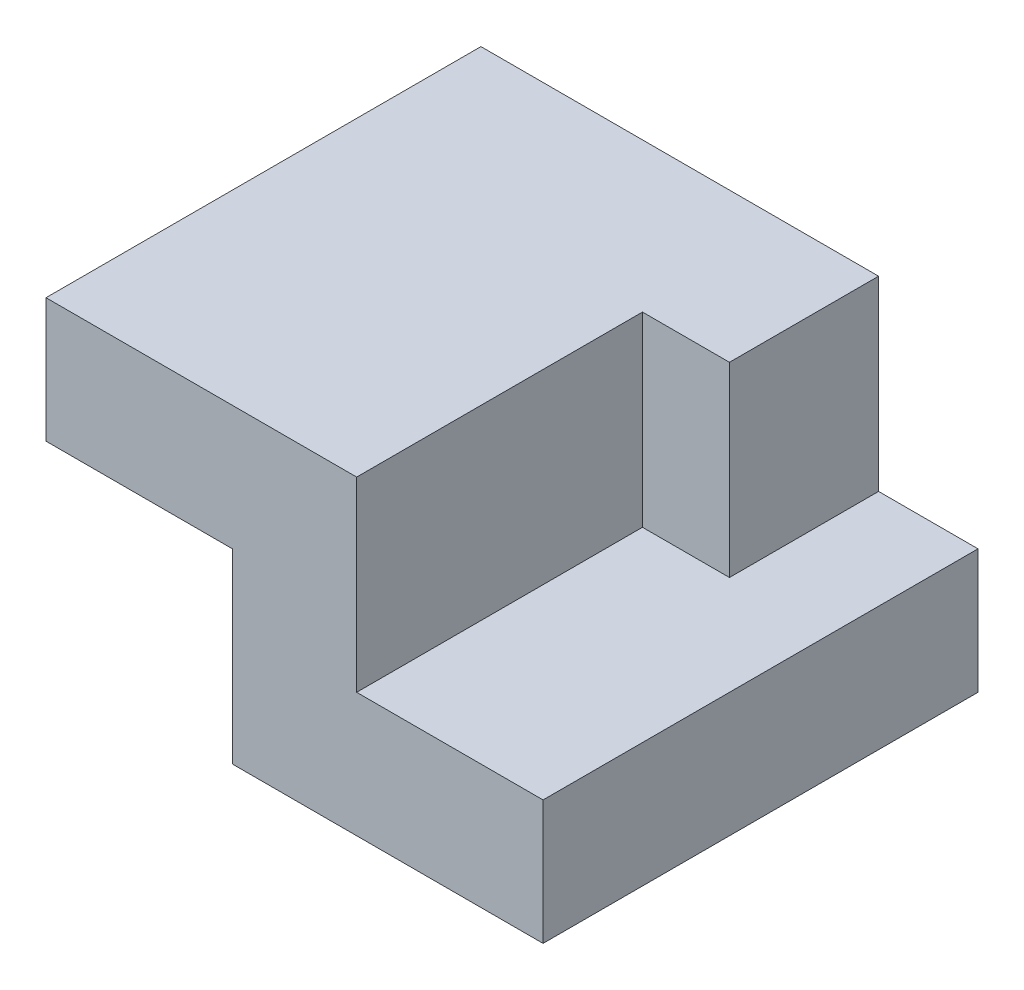
ISO-10303-21;
HEADER;
FILE_DESCRIPTION(('STEP AP214'),'2;1');
FILE_NAME('part.step','',(''),(''),'','','');
FILE_SCHEMA(('AUTOMOTIVE_DESIGN { 1 0 10303 214 1 1 1 1 }'));
ENDSEC;
DATA;
#1=APPLICATION_CONTEXT('core data for automotive mechanical design processes');
#2=APPLICATION_PROTOCOL_DEFINITION('international standard','automotive_design',2000,#1);
#3=PRODUCT_CONTEXT('',#1,'mechanical');
#4=PRODUCT('Part','Part','',(#3));
#5=PRODUCT_RELATED_PRODUCT_CATEGORY('part','',(#4));
#6=PRODUCT_DEFINITION_FORMATION('','',#4);
#7=PRODUCT_DEFINITION_CONTEXT('part definition',#1,'design');
#8=PRODUCT_DEFINITION('design','',#6,#7);
#9=PRODUCT_DEFINITION_SHAPE('','',#8);
#10=(LENGTH_UNIT() NAMED_UNIT(*) SI_UNIT(.MILLI.,.METRE.));
#11=(NAMED_UNIT(*) PLANE_ANGLE_UNIT() SI_UNIT($,.RADIAN.));
#12=(NAMED_UNIT(*) SI_UNIT($,.STERADIAN.) SOLID_ANGLE_UNIT());
#13=UNCERTAINTY_MEASURE_WITH_UNIT(LENGTH_MEASURE(1.E-05),#10,'distance_accuracy_value','');
#14=(GEOMETRIC_REPRESENTATION_CONTEXT(3) GLOBAL_UNCERTAINTY_ASSIGNED_CONTEXT((#13)) GLOBAL_UNIT_ASSIGNED_CONTEXT((#10,
#11,#12)) REPRESENTATION_CONTEXT('',''));
#15=CARTESIAN_POINT('',(0.,0.,0.));
#16=DIRECTION('',(0.,0.,1.));
#17=DIRECTION('',(1.,0.,0.));
#18=AXIS2_PLACEMENT_3D('',#15,#16,#17);
#19=CARTESIAN_POINT('',(-8.92031029265963,45.8552321324574,70.));
#20=DIRECTION('',(-1.,0.,0.));
#21=DIRECTION('',(0.,0.,1.));
#22=AXIS2_PLACEMENT_3D('',#19,#20,#21);
#23=PLANE('',#22);
#24=DIRECTION('',(0.,-1.,0.));
#25=VECTOR('',#24,1.);
#26=CARTESIAN_POINT('',(-8.92031029265963,75.8552321324574,24.));
#27=LINE('',#26,#25);
#28=CARTESIAN_POINT('',(-8.92031029265963,75.8552321324574,24.));
#29=VERTEX_POINT('',#28);
#30=CARTESIAN_POINT('',(-8.92031029265963,45.8552321324574,24.));
#31=VERTEX_POINT('',#30);
#32=EDGE_CURVE('E47',#29,#31,#27,.T.);
#33=ORIENTED_EDGE('',*,*,#32,.F.);
#34=DIRECTION('',(0.,0.,-1.));
#35=VECTOR('',#34,1.);
#36=CARTESIAN_POINT('',(-8.92031029265963,75.8552321324574,70.));
#37=LINE('',#36,#35);
#38=CARTESIAN_POINT('',(-8.92031029265963,75.8552321324574,70.));
#39=VERTEX_POINT('',#38);
#40=EDGE_CURVE('E11',#39,#29,#37,.T.);
#41=ORIENTED_EDGE('',*,*,#40,.F.);
#42=DIRECTION('',(0.,1.,0.));
#43=VECTOR('',#42,1.);
#44=CARTESIAN_POINT('',(-8.92031029265963,45.8552321324574,70.));
#45=LINE('',#44,#43);
#46=CARTESIAN_POINT('',(-8.92031029265963,45.8552321324574,70.));
#47=VERTEX_POINT('',#46);
#48=EDGE_CURVE('E140',#47,#39,#45,.T.);
#49=ORIENTED_EDGE('',*,*,#48,.F.);
#50=DIRECTION('',(0.,0.,-1.));
#51=VECTOR('',#50,1.);
#52=CARTESIAN_POINT('',(-8.92031029265963,45.8552321324574,70.));
#53=LINE('',#52,#51);
#54=EDGE_CURVE('E157',#47,#31,#53,.T.);
#55=ORIENTED_EDGE('',*,*,#54,.T.);
#56=EDGE_LOOP('',(#33,#41,#49,#55));
#57=FACE_BOUND('',#56,.T.);
#58=ADVANCED_FACE('F33',(#57),#23,.F.);
#59=CARTESIAN_POINT('',(21.0796897073403,45.8552321324574,70.));
#60=DIRECTION('',(0.,-1.,0.));
#61=DIRECTION('',(1.,0.,0.));
#62=AXIS2_PLACEMENT_3D('',#59,#60,#61);
#63=PLANE('',#62);
#64=DIRECTION('',(-1.,0.,0.));
#65=VECTOR('',#64,1.);
#66=CARTESIAN_POINT('',(5.07968970734037,45.8552321324574,24.));
#67=LINE('',#66,#65);
#68=CARTESIAN_POINT('',(5.07968970734037,45.8552321324574,24.));
#69=VERTEX_POINT('',#68);
#70=EDGE_CURVE('E136',#69,#31,#67,.T.);
#71=ORIENTED_EDGE('',*,*,#70,.T.);
#72=ORIENTED_EDGE('',*,*,#54,.F.);
#73=DIRECTION('',(-1.,0.,0.));
#74=VECTOR('',#73,1.);
#75=CARTESIAN_POINT('',(21.0796897073403,45.8552321324574,70.));
#76=LINE('',#75,#74);
#77=CARTESIAN_POINT('',(21.0796897073403,45.8552321324574,70.));
#78=VERTEX_POINT('',#77);
#79=EDGE_CURVE('E156',#78,#47,#76,.T.);
#80=ORIENTED_EDGE('',*,*,#79,.F.);
#81=DIRECTION('',(0.,0.,-1.));
#82=VECTOR('',#81,1.);
#83=CARTESIAN_POINT('',(21.0796897073403,45.8552321324574,70.));
#84=LINE('',#83,#82);
#85=CARTESIAN_POINT('',(21.0796897073403,45.8552321324574,0.));
#86=VERTEX_POINT('',#85);
#87=EDGE_CURVE('E170',#78,#86,#84,.T.);
#88=ORIENTED_EDGE('',*,*,#87,.T.);
#89=DIRECTION('',(-1.,0.,0.));
#90=VECTOR('',#89,1.);
#91=CARTESIAN_POINT('',(21.0796897073403,45.8552321324574,0.));
#92=LINE('',#91,#90);
#93=CARTESIAN_POINT('',(5.07968970734037,45.8552321324574,0.));
#94=VERTEX_POINT('',#93);
#95=EDGE_CURVE('E144',#86,#94,#92,.T.);
#96=ORIENTED_EDGE('',*,*,#95,.T.);
#97=DIRECTION('',(0.,0.,-1.));
#98=VECTOR('',#97,1.);
#99=CARTESIAN_POINT('',(5.07968970734037,45.8552321324574,0.));
#100=LINE('',#99,#98);
#101=EDGE_CURVE('E54',#69,#94,#100,.T.);
#102=ORIENTED_EDGE('',*,*,#101,.F.);
#103=EDGE_LOOP('',(#71,#72,#80,#88,#96,#102));
#104=FACE_BOUND('',#103,.T.);
#105=ADVANCED_FACE('F194',(#104),#63,.F.);
#106=CARTESIAN_POINT('',(-8.92031029265963,75.8552321324574,70.));
#107=DIRECTION('',(0.,-1.,0.));
#108=DIRECTION('',(0.,0.,-1.));
#109=AXIS2_PLACEMENT_3D('',#106,#107,#108);
#110=PLANE('',#109);
#111=DIRECTION('',(-1.,0.,0.));
#112=VECTOR('',#111,1.);
#113=CARTESIAN_POINT('',(-8.92031029265963,75.8552321324574,0.));
#114=LINE('',#113,#112);
#115=CARTESIAN_POINT('',(5.07968970734037,75.8552321324574,0.));
#116=VERTEX_POINT('',#115);
#117=CARTESIAN_POINT('',(-58.9203102926596,75.8552321324574,0.));
#118=VERTEX_POINT('',#117);
#119=EDGE_CURVE('E110',#116,#118,#114,.T.);
#120=ORIENTED_EDGE('',*,*,#119,.T.);
#121=DIRECTION('',(0.,0.,-1.));
#122=VECTOR('',#121,1.);
#123=CARTESIAN_POINT('',(-58.9203102926596,75.8552321324574,70.));
#124=LINE('',#123,#122);
#125=CARTESIAN_POINT('',(-58.9203102926596,75.8552321324574,70.));
#126=VERTEX_POINT('',#125);
#127=EDGE_CURVE('E40',#126,#118,#124,.T.);
#128=ORIENTED_EDGE('',*,*,#127,.F.);
#129=DIRECTION('',(-1.,0.,0.));
#130=VECTOR('',#129,1.);
#131=CARTESIAN_POINT('',(-8.92031029265963,75.8552321324574,70.));
#132=LINE('',#131,#130);
#133=EDGE_CURVE('E143',#39,#126,#132,.T.);
#134=ORIENTED_EDGE('',*,*,#133,.F.);
#135=ORIENTED_EDGE('',*,*,#40,.T.);
#136=DIRECTION('',(-1.,0.,0.));
#137=VECTOR('',#136,1.);
#138=CARTESIAN_POINT('',(5.07968970734037,75.8552321324574,24.));
#139=LINE('',#138,#137);
#140=CARTESIAN_POINT('',(5.07968970734037,75.8552321324574,24.));
#141=VERTEX_POINT('',#140);
#142=EDGE_CURVE('E121',#141,#29,#139,.T.);
#143=ORIENTED_EDGE('',*,*,#142,.F.);
#144=DIRECTION('',(0.,0.,1.));
#145=VECTOR('',#144,1.);
#146=CARTESIAN_POINT('',(5.07968970734037,75.8552321324574,0.));
#147=LINE('',#146,#145);
#148=EDGE_CURVE('E124',#116,#141,#147,.T.);
#149=ORIENTED_EDGE('',*,*,#148,.F.);
#150=EDGE_LOOP('',(#120,#128,#134,#135,#143,#149));
#151=FACE_BOUND('',#150,.T.);
#152=ADVANCED_FACE('F125',(#151),#110,.F.);
#153=CARTESIAN_POINT('',(-58.9203102926596,75.8552321324574,70.));
#154=DIRECTION('',(1.,0.,0.));
#155=DIRECTION('',(0.,0.,-1.));
#156=AXIS2_PLACEMENT_3D('',#153,#154,#155);
#157=PLANE('',#156);
#158=DIRECTION('',(0.,-1.,0.));
#159=VECTOR('',#158,1.);
#160=CARTESIAN_POINT('',(-58.9203102926596,75.8552321324574,0.));
#161=LINE('',#160,#159);
#162=CARTESIAN_POINT('',(-58.9203102926596,55.8552321324574,0.));
#163=VERTEX_POINT('',#162);
#164=EDGE_CURVE('E117',#118,#163,#161,.T.);
#165=ORIENTED_EDGE('',*,*,#164,.T.);
#166=DIRECTION('',(0.,0.,-1.));
#167=VECTOR('',#166,1.);
#168=CARTESIAN_POINT('',(-58.9203102926596,55.8552321324574,70.));
#169=LINE('',#168,#167);
#170=CARTESIAN_POINT('',(-58.9203102926596,55.8552321324574,70.));
#171=VERTEX_POINT('',#170);
#172=EDGE_CURVE('E182',#171,#163,#169,.T.);
#173=ORIENTED_EDGE('',*,*,#172,.F.);
#174=DIRECTION('',(0.,-1.,0.));
#175=VECTOR('',#174,1.);
#176=CARTESIAN_POINT('',(-58.9203102926596,75.8552321324574,70.));
#177=LINE('',#176,#175);
#178=EDGE_CURVE('E146',#126,#171,#177,.T.);
#179=ORIENTED_EDGE('',*,*,#178,.F.);
#180=ORIENTED_EDGE('',*,*,#127,.T.);
#181=EDGE_LOOP('',(#165,#173,#179,#180));
#182=FACE_BOUND('',#181,.T.);
#183=ADVANCED_FACE('F186',(#182),#157,.F.);
#184=CARTESIAN_POINT('',(-58.9203102926596,55.8552321324574,70.));
#185=DIRECTION('',(0.,1.,0.));
#186=DIRECTION('',(0.,0.,1.));
#187=AXIS2_PLACEMENT_3D('',#184,#185,#186);
#188=PLANE('',#187);
#189=DIRECTION('',(1.,0.,0.));
#190=VECTOR('',#189,1.);
#191=CARTESIAN_POINT('',(-58.9203102926596,55.8552321324574,0.));
#192=LINE('',#191,#190);
#193=CARTESIAN_POINT('',(-28.9203102926596,55.8552321324574,0.));
#194=VERTEX_POINT('',#193);
#195=EDGE_CURVE('E160',#163,#194,#192,.T.);
#196=ORIENTED_EDGE('',*,*,#195,.T.);
#197=DIRECTION('',(0.,0.,-1.));
#198=VECTOR('',#197,1.);
#199=CARTESIAN_POINT('',(-28.9203102926596,55.8552321324574,70.));
#200=LINE('',#199,#198);
#201=CARTESIAN_POINT('',(-28.9203102926596,55.8552321324574,70.));
#202=VERTEX_POINT('',#201);
#203=EDGE_CURVE('E179',#202,#194,#200,.T.);
#204=ORIENTED_EDGE('',*,*,#203,.F.);
#205=DIRECTION('',(1.,0.,0.));
#206=VECTOR('',#205,1.);
#207=CARTESIAN_POINT('',(-58.9203102926596,55.8552321324574,70.));
#208=LINE('',#207,#206);
#209=EDGE_CURVE('E148',#171,#202,#208,.T.);
#210=ORIENTED_EDGE('',*,*,#209,.F.);
#211=ORIENTED_EDGE('',*,*,#172,.T.);
#212=EDGE_LOOP('',(#196,#204,#210,#211));
#213=FACE_BOUND('',#212,.T.);
#214=ADVANCED_FACE('F216',(#213),#188,.F.);
#215=CARTESIAN_POINT('',(-28.9203102926596,55.8552321324574,70.));
#216=DIRECTION('',(1.,0.,0.));
#217=DIRECTION('',(0.,0.,-1.));
#218=AXIS2_PLACEMENT_3D('',#215,#216,#217);
#219=PLANE('',#218);
#220=DIRECTION('',(0.,-1.,0.));
#221=VECTOR('',#220,1.);
#222=CARTESIAN_POINT('',(-28.9203102926596,55.8552321324574,0.));
#223=LINE('',#222,#221);
#224=CARTESIAN_POINT('',(-28.9203102926596,25.8552321324574,0.));
#225=VERTEX_POINT('',#224);
#226=EDGE_CURVE('E162',#194,#225,#223,.T.);
#227=ORIENTED_EDGE('',*,*,#226,.T.);
#228=DIRECTION('',(0.,0.,-1.));
#229=VECTOR('',#228,1.);
#230=CARTESIAN_POINT('',(-28.9203102926596,25.8552321324574,70.));
#231=LINE('',#230,#229);
#232=CARTESIAN_POINT('',(-28.9203102926596,25.8552321324574,70.));
#233=VERTEX_POINT('',#232);
#234=EDGE_CURVE('E176',#233,#225,#231,.T.);
#235=ORIENTED_EDGE('',*,*,#234,.F.);
#236=DIRECTION('',(0.,-1.,0.));
#237=VECTOR('',#236,1.);
#238=CARTESIAN_POINT('',(-28.9203102926596,55.8552321324574,70.));
#239=LINE('',#238,#237);
#240=EDGE_CURVE('E150',#202,#233,#239,.T.);
#241=ORIENTED_EDGE('',*,*,#240,.F.);
#242=ORIENTED_EDGE('',*,*,#203,.T.);
#243=EDGE_LOOP('',(#227,#235,#241,#242));
#244=FACE_BOUND('',#243,.T.);
#245=ADVANCED_FACE('F212',(#244),#219,.F.);
#246=CARTESIAN_POINT('',(-28.9203102926596,25.8552321324574,70.));
#247=DIRECTION('',(0.,1.,0.));
#248=DIRECTION('',(-1.,0.,0.));
#249=AXIS2_PLACEMENT_3D('',#246,#247,#248);
#250=PLANE('',#249);
#251=DIRECTION('',(1.,0.,0.));
#252=VECTOR('',#251,1.);
#253=CARTESIAN_POINT('',(-28.9203102926596,25.8552321324574,0.));
#254=LINE('',#253,#252);
#255=CARTESIAN_POINT('',(21.0796897073404,25.8552321324574,0.));
#256=VERTEX_POINT('',#255);
#257=EDGE_CURVE('E164',#225,#256,#254,.T.);
#258=ORIENTED_EDGE('',*,*,#257,.T.);
#259=DIRECTION('',(0.,0.,-1.));
#260=VECTOR('',#259,1.);
#261=CARTESIAN_POINT('',(21.0796897073404,25.8552321324574,70.));
#262=LINE('',#261,#260);
#263=CARTESIAN_POINT('',(21.0796897073404,25.8552321324574,70.));
#264=VERTEX_POINT('',#263);
#265=EDGE_CURVE('E173',#264,#256,#262,.T.);
#266=ORIENTED_EDGE('',*,*,#265,.F.);
#267=DIRECTION('',(1.,0.,0.));
#268=VECTOR('',#267,1.);
#269=CARTESIAN_POINT('',(-28.9203102926596,25.8552321324574,70.));
#270=LINE('',#269,#268);
#271=EDGE_CURVE('E152',#233,#264,#270,.T.);
#272=ORIENTED_EDGE('',*,*,#271,.F.);
#273=ORIENTED_EDGE('',*,*,#234,.T.);
#274=EDGE_LOOP('',(#258,#266,#272,#273));
#275=FACE_BOUND('',#274,.T.);
#276=ADVANCED_FACE('F208',(#275),#250,.F.);
#277=CARTESIAN_POINT('',(21.0796897073404,25.8552321324574,70.));
#278=DIRECTION('',(-1.,0.,0.));
#279=DIRECTION('',(0.,-1.,0.));
#280=AXIS2_PLACEMENT_3D('',#277,#278,#279);
#281=PLANE('',#280);
#282=DIRECTION('',(0.,1.,0.));
#283=VECTOR('',#282,1.);
#284=CARTESIAN_POINT('',(21.0796897073404,25.8552321324574,0.));
#285=LINE('',#284,#283);
#286=EDGE_CURVE('E166',#256,#86,#285,.T.);
#287=ORIENTED_EDGE('',*,*,#286,.T.);
#288=ORIENTED_EDGE('',*,*,#87,.F.);
#289=DIRECTION('',(0.,1.,0.));
#290=VECTOR('',#289,1.);
#291=CARTESIAN_POINT('',(21.0796897073404,25.8552321324574,70.));
#292=LINE('',#291,#290);
#293=EDGE_CURVE('E154',#264,#78,#292,.T.);
#294=ORIENTED_EDGE('',*,*,#293,.F.);
#295=ORIENTED_EDGE('',*,*,#265,.T.);
#296=EDGE_LOOP('',(#287,#288,#294,#295));
#297=FACE_BOUND('',#296,.T.);
#298=ADVANCED_FACE('F205',(#297),#281,.F.);
#299=CARTESIAN_POINT('',(0.,0.,70.));
#300=DIRECTION('',(0.,0.,1.));
#301=DIRECTION('',(1.,0.,0.));
#302=AXIS2_PLACEMENT_3D('',#299,#300,#301);
#303=PLANE('',#302);
#304=ORIENTED_EDGE('',*,*,#48,.T.);
#305=ORIENTED_EDGE('',*,*,#133,.T.);
#306=ORIENTED_EDGE('',*,*,#178,.T.);
#307=ORIENTED_EDGE('',*,*,#209,.T.);
#308=ORIENTED_EDGE('',*,*,#240,.T.);
#309=ORIENTED_EDGE('',*,*,#271,.T.);
#310=ORIENTED_EDGE('',*,*,#293,.T.);
#311=ORIENTED_EDGE('',*,*,#79,.T.);
#312=EDGE_LOOP('',(#304,#305,#306,#307,#308,#309,#310,#311));
#313=FACE_BOUND('',#312,.T.);
#314=ADVANCED_FACE('F190',(#313),#303,.T.);
#315=CARTESIAN_POINT('',(0.,0.,0.));
#316=DIRECTION('',(0.,0.,1.));
#317=DIRECTION('',(1.,0.,0.));
#318=AXIS2_PLACEMENT_3D('',#315,#316,#317);
#319=PLANE('',#318);
#320=ORIENTED_EDGE('',*,*,#119,.F.);
#321=DIRECTION('',(0.,1.,0.));
#322=VECTOR('',#321,1.);
#323=CARTESIAN_POINT('',(5.07968970734037,75.8552321324574,0.));
#324=LINE('',#323,#322);
#325=EDGE_CURVE('E115',#94,#116,#324,.T.);
#326=ORIENTED_EDGE('',*,*,#325,.F.);
#327=ORIENTED_EDGE('',*,*,#95,.F.);
#328=ORIENTED_EDGE('',*,*,#286,.F.);
#329=ORIENTED_EDGE('',*,*,#257,.F.);
#330=ORIENTED_EDGE('',*,*,#226,.F.);
#331=ORIENTED_EDGE('',*,*,#195,.F.);
#332=ORIENTED_EDGE('',*,*,#164,.F.);
#333=EDGE_LOOP('',(#320,#326,#327,#328,#329,#330,#331,#332));
#334=FACE_BOUND('',#333,.T.);
#335=ADVANCED_FACE('F112',(#334),#319,.F.);
#336=CARTESIAN_POINT('',(5.07968970734037,75.8552321324574,24.));
#337=DIRECTION('',(0.,0.,-1.));
#338=DIRECTION('',(0.,1.,0.));
#339=AXIS2_PLACEMENT_3D('',#336,#337,#338);
#340=PLANE('',#339);
#341=ORIENTED_EDGE('',*,*,#32,.T.);
#342=ORIENTED_EDGE('',*,*,#70,.F.);
#343=DIRECTION('',(0.,-1.,0.));
#344=VECTOR('',#343,1.);
#345=CARTESIAN_POINT('',(5.07968970734037,75.8552321324574,24.));
#346=LINE('',#345,#344);
#347=EDGE_CURVE('E129',#141,#69,#346,.T.);
#348=ORIENTED_EDGE('',*,*,#347,.F.);
#349=ORIENTED_EDGE('',*,*,#142,.T.);
#350=EDGE_LOOP('',(#341,#342,#348,#349));
#351=FACE_BOUND('',#350,.T.);
#352=ADVANCED_FACE('F253',(#351),#340,.F.);
#353=CARTESIAN_POINT('',(5.07968970734037,0.,0.));
#354=DIRECTION('',(-1.,0.,0.));
#355=DIRECTION('',(0.,0.,1.));
#356=AXIS2_PLACEMENT_3D('',#353,#354,#355);
#357=PLANE('',#356);
#358=ORIENTED_EDGE('',*,*,#325,.T.);
#359=ORIENTED_EDGE('',*,*,#148,.T.);
#360=ORIENTED_EDGE('',*,*,#347,.T.);
#361=ORIENTED_EDGE('',*,*,#101,.T.);
#362=EDGE_LOOP('',(#358,#359,#360,#361));
#363=FACE_BOUND('',#362,.T.);
#364=ADVANCED_FACE('F131',(#363),#357,.F.);
#365=CLOSED_SHELL('',(#58,#105,#152,#183,#214,#245,#276,#298,#314,#335,#352,#364));
#366=MANIFOLD_SOLID_BREP('B2',#365);
#367=ADVANCED_BREP_SHAPE_REPRESENTATION('',(#18,#366),#14);
#368=SHAPE_DEFINITION_REPRESENTATION(#9,#367);
ENDSEC;
END-ISO-10303-21;
